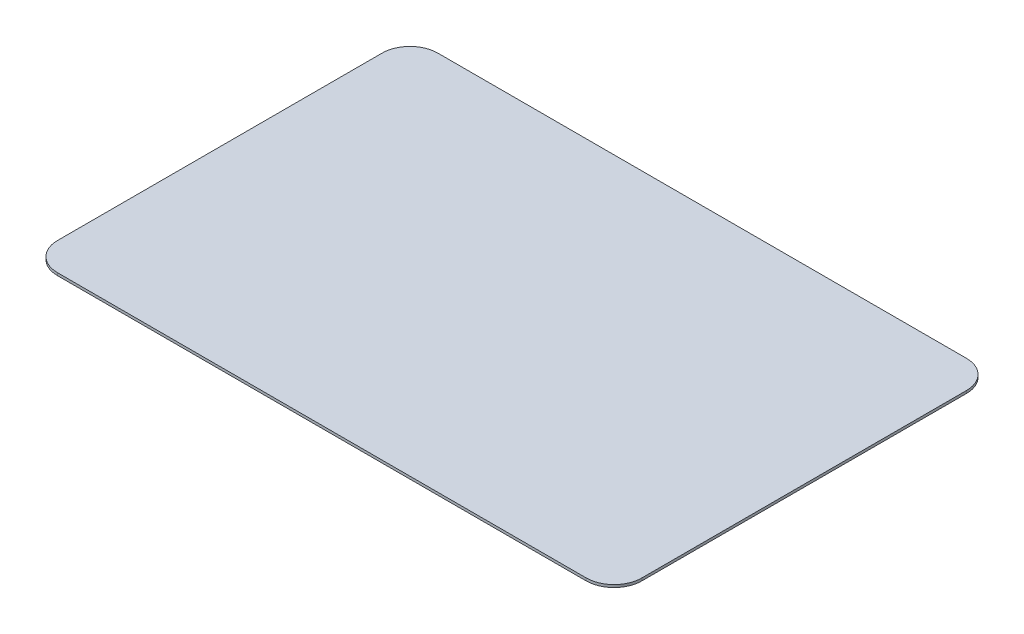
ISO-10303-21;
HEADER;
FILE_DESCRIPTION(('STEP AP214'),'2;1');
FILE_NAME('part.step','',(''),(''),'','','');
FILE_SCHEMA(('AUTOMOTIVE_DESIGN { 1 0 10303 214 1 1 1 1 }'));
ENDSEC;
DATA;
#1=APPLICATION_CONTEXT('core data for automotive mechanical design processes');
#2=APPLICATION_PROTOCOL_DEFINITION('international standard','automotive_design',2000,#1);
#3=PRODUCT_CONTEXT('',#1,'mechanical');
#4=PRODUCT('Part','Part','',(#3));
#5=PRODUCT_RELATED_PRODUCT_CATEGORY('part','',(#4));
#6=PRODUCT_DEFINITION_FORMATION('','',#4);
#7=PRODUCT_DEFINITION_CONTEXT('part definition',#1,'design');
#8=PRODUCT_DEFINITION('design','',#6,#7);
#9=PRODUCT_DEFINITION_SHAPE('','',#8);
#10=(LENGTH_UNIT() NAMED_UNIT(*) SI_UNIT(.MILLI.,.METRE.));
#11=(NAMED_UNIT(*) PLANE_ANGLE_UNIT() SI_UNIT($,.RADIAN.));
#12=(NAMED_UNIT(*) SI_UNIT($,.STERADIAN.) SOLID_ANGLE_UNIT());
#13=UNCERTAINTY_MEASURE_WITH_UNIT(LENGTH_MEASURE(1.E-05),#10,'distance_accuracy_value','');
#14=(GEOMETRIC_REPRESENTATION_CONTEXT(3) GLOBAL_UNCERTAINTY_ASSIGNED_CONTEXT((#13)) GLOBAL_UNIT_ASSIGNED_CONTEXT((#10,
#11,#12)) REPRESENTATION_CONTEXT('',''));
#15=CARTESIAN_POINT('',(0.,0.,0.));
#16=DIRECTION('',(0.,0.,1.));
#17=DIRECTION('',(1.,0.,0.));
#18=AXIS2_PLACEMENT_3D('',#15,#16,#17);
#19=CARTESIAN_POINT('',(60.,0.28,3.));
#20=DIRECTION('',(0.,-1.,0.));
#21=DIRECTION('',(0.,0.,-1.));
#22=AXIS2_PLACEMENT_3D('',#19,#20,#21);
#23=CYLINDRICAL_SURFACE('',#22,3.);
#24=CARTESIAN_POINT('',(60.,0.,3.));
#25=DIRECTION('',(0.,1.,0.));
#26=DIRECTION('',(0.,0.,-1.));
#27=AXIS2_PLACEMENT_3D('',#24,#25,#26);
#28=CIRCLE('',#27,3.);
#29=CARTESIAN_POINT('',(63.,0.,3.00000000000002));
#30=VERTEX_POINT('',#29);
#31=CARTESIAN_POINT('',(60.,0.,0.));
#32=VERTEX_POINT('',#31);
#33=EDGE_CURVE('E142',#30,#32,#28,.T.);
#34=ORIENTED_EDGE('',*,*,#33,.T.);
#35=DIRECTION('',(0.,-1.,0.));
#36=VECTOR('',#35,1.);
#37=CARTESIAN_POINT('',(60.,0.28,0.));
#38=LINE('',#37,#36);
#39=CARTESIAN_POINT('',(60.,0.28,0.));
#40=VERTEX_POINT('',#39);
#41=EDGE_CURVE('E11',#40,#32,#38,.T.);
#42=ORIENTED_EDGE('',*,*,#41,.F.);
#43=CARTESIAN_POINT('',(60.,0.28,3.));
#44=DIRECTION('',(0.,1.,0.));
#45=DIRECTION('',(0.,0.,-1.));
#46=AXIS2_PLACEMENT_3D('',#43,#44,#45);
#47=CIRCLE('',#46,3.);
#48=CARTESIAN_POINT('',(63.,0.28,3.00000000000002));
#49=VERTEX_POINT('',#48);
#50=EDGE_CURVE('E164',#49,#40,#47,.T.);
#51=ORIENTED_EDGE('',*,*,#50,.F.);
#52=DIRECTION('',(0.,-1.,0.));
#53=VECTOR('',#52,1.);
#54=CARTESIAN_POINT('',(63.,0.28,3.00000000000002));
#55=LINE('',#54,#53);
#56=EDGE_CURVE('E138',#49,#30,#55,.T.);
#57=ORIENTED_EDGE('',*,*,#56,.T.);
#58=EDGE_LOOP('',(#34,#42,#51,#57));
#59=FACE_BOUND('',#58,.T.);
#60=ADVANCED_FACE('F41',(#59),#23,.T.);
#61=CARTESIAN_POINT('',(3.00000000000002,0.28,0.));
#62=DIRECTION('',(0.,0.,1.));
#63=DIRECTION('',(1.,0.,0.));
#64=AXIS2_PLACEMENT_3D('',#61,#62,#63);
#65=PLANE('',#64);
#66=DIRECTION('',(-1.,0.,0.));
#67=VECTOR('',#66,1.);
#68=CARTESIAN_POINT('',(3.00000000000002,0.,0.));
#69=LINE('',#68,#67);
#70=CARTESIAN_POINT('',(3.00000000000002,0.,0.));
#71=VERTEX_POINT('',#70);
#72=EDGE_CURVE('E146',#32,#71,#69,.T.);
#73=ORIENTED_EDGE('',*,*,#72,.T.);
#74=DIRECTION('',(0.,-1.,0.));
#75=VECTOR('',#74,1.);
#76=CARTESIAN_POINT('',(3.00000000000002,0.28,0.));
#77=LINE('',#76,#75);
#78=CARTESIAN_POINT('',(3.00000000000002,0.28,0.));
#79=VERTEX_POINT('',#78);
#80=EDGE_CURVE('E50',#79,#71,#77,.T.);
#81=ORIENTED_EDGE('',*,*,#80,.F.);
#82=DIRECTION('',(-1.,0.,0.));
#83=VECTOR('',#82,1.);
#84=CARTESIAN_POINT('',(3.00000000000002,0.28,0.));
#85=LINE('',#84,#83);
#86=EDGE_CURVE('E101',#40,#79,#85,.T.);
#87=ORIENTED_EDGE('',*,*,#86,.F.);
#88=ORIENTED_EDGE('',*,*,#41,.T.);
#89=EDGE_LOOP('',(#73,#81,#87,#88));
#90=FACE_BOUND('',#89,.T.);
#91=ADVANCED_FACE('F210',(#90),#65,.F.);
#92=CARTESIAN_POINT('',(3.,0.28,3.));
#93=DIRECTION('',(0.,-1.,0.));
#94=DIRECTION('',(0.,0.,-1.));
#95=AXIS2_PLACEMENT_3D('',#92,#93,#94);
#96=CYLINDRICAL_SURFACE('',#95,3.);
#97=CARTESIAN_POINT('',(3.,0.,3.));
#98=DIRECTION('',(0.,1.,0.));
#99=DIRECTION('',(0.,0.,1.));
#100=AXIS2_PLACEMENT_3D('',#97,#98,#99);
#101=CIRCLE('',#100,3.);
#102=CARTESIAN_POINT('',(0.,0.,3.00000000000002));
#103=VERTEX_POINT('',#102);
#104=EDGE_CURVE('E149',#71,#103,#101,.T.);
#105=ORIENTED_EDGE('',*,*,#104,.T.);
#106=DIRECTION('',(0.,-1.,0.));
#107=VECTOR('',#106,1.);
#108=CARTESIAN_POINT('',(0.,0.28,3.00000000000002));
#109=LINE('',#108,#107);
#110=CARTESIAN_POINT('',(0.,0.28,3.00000000000002));
#111=VERTEX_POINT('',#110);
#112=EDGE_CURVE('E175',#111,#103,#109,.T.);
#113=ORIENTED_EDGE('',*,*,#112,.F.);
#114=CARTESIAN_POINT('',(3.,0.28,3.));
#115=DIRECTION('',(0.,1.,0.));
#116=DIRECTION('',(0.,0.,1.));
#117=AXIS2_PLACEMENT_3D('',#114,#115,#116);
#118=CIRCLE('',#117,3.);
#119=EDGE_CURVE('E185',#79,#111,#118,.T.);
#120=ORIENTED_EDGE('',*,*,#119,.F.);
#121=ORIENTED_EDGE('',*,*,#80,.T.);
#122=EDGE_LOOP('',(#105,#113,#120,#121));
#123=FACE_BOUND('',#122,.T.);
#124=ADVANCED_FACE('F183',(#123),#96,.T.);
#125=CARTESIAN_POINT('',(0.,0.28,3.00000000000002));
#126=DIRECTION('',(1.,0.,0.));
#127=DIRECTION('',(0.,0.,-1.));
#128=AXIS2_PLACEMENT_3D('',#125,#126,#127);
#129=PLANE('',#128);
#130=DIRECTION('',(0.,0.,1.));
#131=VECTOR('',#130,1.);
#132=CARTESIAN_POINT('',(0.,0.,3.00000000000002));
#133=LINE('',#132,#131);
#134=CARTESIAN_POINT('',(0.,0.,38.));
#135=VERTEX_POINT('',#134);
#136=EDGE_CURVE('E152',#103,#135,#133,.T.);
#137=ORIENTED_EDGE('',*,*,#136,.T.);
#138=DIRECTION('',(0.,-1.,0.));
#139=VECTOR('',#138,1.);
#140=CARTESIAN_POINT('',(0.,0.28,38.));
#141=LINE('',#140,#139);
#142=CARTESIAN_POINT('',(0.,0.28,38.));
#143=VERTEX_POINT('',#142);
#144=EDGE_CURVE('E171',#143,#135,#141,.T.);
#145=ORIENTED_EDGE('',*,*,#144,.F.);
#146=DIRECTION('',(0.,0.,1.));
#147=VECTOR('',#146,1.);
#148=CARTESIAN_POINT('',(0.,0.28,3.00000000000002));
#149=LINE('',#148,#147);
#150=EDGE_CURVE('E198',#111,#143,#149,.T.);
#151=ORIENTED_EDGE('',*,*,#150,.F.);
#152=ORIENTED_EDGE('',*,*,#112,.T.);
#153=EDGE_LOOP('',(#137,#145,#151,#152));
#154=FACE_BOUND('',#153,.T.);
#155=ADVANCED_FACE('F193',(#154),#129,.F.);
#156=CARTESIAN_POINT('',(3.,0.28,38.));
#157=DIRECTION('',(0.,-1.,0.));
#158=DIRECTION('',(0.,0.,-1.));
#159=AXIS2_PLACEMENT_3D('',#156,#157,#158);
#160=CYLINDRICAL_SURFACE('',#159,3.);
#161=CARTESIAN_POINT('',(3.,0.,38.));
#162=DIRECTION('',(0.,1.,0.));
#163=DIRECTION('',(0.,0.,1.));
#164=AXIS2_PLACEMENT_3D('',#161,#162,#163);
#165=CIRCLE('',#164,3.);
#166=CARTESIAN_POINT('',(3.,0.,41.));
#167=VERTEX_POINT('',#166);
#168=EDGE_CURVE('E155',#135,#167,#165,.T.);
#169=ORIENTED_EDGE('',*,*,#168,.T.);
#170=DIRECTION('',(0.,-1.,0.));
#171=VECTOR('',#170,1.);
#172=CARTESIAN_POINT('',(3.,0.28,41.));
#173=LINE('',#172,#171);
#174=CARTESIAN_POINT('',(3.,0.28,41.));
#175=VERTEX_POINT('',#174);
#176=EDGE_CURVE('E131',#175,#167,#173,.T.);
#177=ORIENTED_EDGE('',*,*,#176,.F.);
#178=CARTESIAN_POINT('',(3.,0.28,38.));
#179=DIRECTION('',(0.,1.,0.));
#180=DIRECTION('',(0.,0.,1.));
#181=AXIS2_PLACEMENT_3D('',#178,#179,#180);
#182=CIRCLE('',#181,3.);
#183=EDGE_CURVE('E120',#143,#175,#182,.T.);
#184=ORIENTED_EDGE('',*,*,#183,.F.);
#185=ORIENTED_EDGE('',*,*,#144,.T.);
#186=EDGE_LOOP('',(#169,#177,#184,#185));
#187=FACE_BOUND('',#186,.T.);
#188=ADVANCED_FACE('F196',(#187),#160,.T.);
#189=CARTESIAN_POINT('',(3.00000000000003,0.28,41.));
#190=DIRECTION('',(0.,0.,-1.));
#191=DIRECTION('',(-1.,0.,0.));
#192=AXIS2_PLACEMENT_3D('',#189,#190,#191);
#193=PLANE('',#192);
#194=DIRECTION('',(1.,0.,0.));
#195=VECTOR('',#194,1.);
#196=CARTESIAN_POINT('',(3.00000000000003,0.,41.));
#197=LINE('',#196,#195);
#198=CARTESIAN_POINT('',(60.,0.,41.));
#199=VERTEX_POINT('',#198);
#200=EDGE_CURVE('E129',#167,#199,#197,.T.);
#201=ORIENTED_EDGE('',*,*,#200,.T.);
#202=DIRECTION('',(0.,-1.,0.));
#203=VECTOR('',#202,1.);
#204=CARTESIAN_POINT('',(60.,0.28,41.));
#205=LINE('',#204,#203);
#206=CARTESIAN_POINT('',(60.,0.28,41.));
#207=VERTEX_POINT('',#206);
#208=EDGE_CURVE('E126',#207,#199,#205,.T.);
#209=ORIENTED_EDGE('',*,*,#208,.F.);
#210=DIRECTION('',(1.,0.,0.));
#211=VECTOR('',#210,1.);
#212=CARTESIAN_POINT('',(3.00000000000003,0.28,41.));
#213=LINE('',#212,#211);
#214=EDGE_CURVE('E114',#175,#207,#213,.T.);
#215=ORIENTED_EDGE('',*,*,#214,.F.);
#216=ORIENTED_EDGE('',*,*,#176,.T.);
#217=EDGE_LOOP('',(#201,#209,#215,#216));
#218=FACE_BOUND('',#217,.T.);
#219=ADVANCED_FACE('F127',(#218),#193,.F.);
#220=CARTESIAN_POINT('',(60.,0.28,38.));
#221=DIRECTION('',(0.,-1.,0.));
#222=DIRECTION('',(0.,0.,-1.));
#223=AXIS2_PLACEMENT_3D('',#220,#221,#222);
#224=CYLINDRICAL_SURFACE('',#223,3.);
#225=CARTESIAN_POINT('',(60.,0.,38.));
#226=DIRECTION('',(0.,1.,0.));
#227=DIRECTION('',(0.,0.,1.));
#228=AXIS2_PLACEMENT_3D('',#225,#226,#227);
#229=CIRCLE('',#228,3.);
#230=CARTESIAN_POINT('',(63.,0.,38.));
#231=VERTEX_POINT('',#230);
#232=EDGE_CURVE('E87',#199,#231,#229,.T.);
#233=ORIENTED_EDGE('',*,*,#232,.T.);
#234=DIRECTION('',(0.,-1.,0.));
#235=VECTOR('',#234,1.);
#236=CARTESIAN_POINT('',(63.,0.28,38.));
#237=LINE('',#236,#235);
#238=CARTESIAN_POINT('',(63.,0.28,38.));
#239=VERTEX_POINT('',#238);
#240=EDGE_CURVE('E132',#239,#231,#237,.T.);
#241=ORIENTED_EDGE('',*,*,#240,.F.);
#242=CARTESIAN_POINT('',(60.,0.28,38.));
#243=DIRECTION('',(0.,1.,0.));
#244=DIRECTION('',(0.,0.,1.));
#245=AXIS2_PLACEMENT_3D('',#242,#243,#244);
#246=CIRCLE('',#245,3.);
#247=EDGE_CURVE('E118',#207,#239,#246,.T.);
#248=ORIENTED_EDGE('',*,*,#247,.F.);
#249=ORIENTED_EDGE('',*,*,#208,.T.);
#250=EDGE_LOOP('',(#233,#241,#248,#249));
#251=FACE_BOUND('',#250,.T.);
#252=ADVANCED_FACE('F134',(#251),#224,.T.);
#253=CARTESIAN_POINT('',(63.,0.28,3.00000000000002));
#254=DIRECTION('',(-1.,0.,0.));
#255=DIRECTION('',(0.,0.,1.));
#256=AXIS2_PLACEMENT_3D('',#253,#254,#255);
#257=PLANE('',#256);
#258=DIRECTION('',(0.,0.,-1.));
#259=VECTOR('',#258,1.);
#260=CARTESIAN_POINT('',(63.,0.,3.00000000000002));
#261=LINE('',#260,#259);
#262=EDGE_CURVE('E93',#231,#30,#261,.T.);
#263=ORIENTED_EDGE('',*,*,#262,.T.);
#264=ORIENTED_EDGE('',*,*,#56,.F.);
#265=DIRECTION('',(0.,0.,-1.));
#266=VECTOR('',#265,1.);
#267=CARTESIAN_POINT('',(63.,0.28,3.00000000000002));
#268=LINE('',#267,#266);
#269=EDGE_CURVE('E58',#239,#49,#268,.T.);
#270=ORIENTED_EDGE('',*,*,#269,.F.);
#271=ORIENTED_EDGE('',*,*,#240,.T.);
#272=EDGE_LOOP('',(#263,#264,#270,#271));
#273=FACE_BOUND('',#272,.T.);
#274=ADVANCED_FACE('F226',(#273),#257,.F.);
#275=CARTESIAN_POINT('',(60.,0.28,3.));
#276=DIRECTION('',(0.,-1.,0.));
#277=DIRECTION('',(0.,0.,-1.));
#278=AXIS2_PLACEMENT_3D('',#275,#276,#277);
#279=PLANE('',#278);
#280=ORIENTED_EDGE('',*,*,#50,.T.);
#281=ORIENTED_EDGE('',*,*,#86,.T.);
#282=ORIENTED_EDGE('',*,*,#119,.T.);
#283=ORIENTED_EDGE('',*,*,#150,.T.);
#284=ORIENTED_EDGE('',*,*,#183,.T.);
#285=ORIENTED_EDGE('',*,*,#214,.T.);
#286=ORIENTED_EDGE('',*,*,#247,.T.);
#287=ORIENTED_EDGE('',*,*,#269,.T.);
#288=EDGE_LOOP('',(#280,#281,#282,#283,#284,#285,#286,#287));
#289=FACE_BOUND('',#288,.T.);
#290=ADVANCED_FACE('F116',(#289),#279,.F.);
#291=CARTESIAN_POINT('',(60.,0.,3.));
#292=DIRECTION('',(0.,-1.,0.));
#293=DIRECTION('',(0.,0.,-1.));
#294=AXIS2_PLACEMENT_3D('',#291,#292,#293);
#295=PLANE('',#294);
#296=ORIENTED_EDGE('',*,*,#33,.F.);
#297=ORIENTED_EDGE('',*,*,#262,.F.);
#298=ORIENTED_EDGE('',*,*,#232,.F.);
#299=ORIENTED_EDGE('',*,*,#200,.F.);
#300=ORIENTED_EDGE('',*,*,#168,.F.);
#301=ORIENTED_EDGE('',*,*,#136,.F.);
#302=ORIENTED_EDGE('',*,*,#104,.F.);
#303=ORIENTED_EDGE('',*,*,#72,.F.);
#304=EDGE_LOOP('',(#296,#297,#298,#299,#300,#301,#302,#303));
#305=FACE_BOUND('',#304,.T.);
#306=ADVANCED_FACE('F189',(#305),#295,.T.);
#307=CLOSED_SHELL('',(#60,#91,#124,#155,#188,#219,#252,#274,#290,#306));
#308=MANIFOLD_SOLID_BREP('B2',#307);
#309=ADVANCED_BREP_SHAPE_REPRESENTATION('',(#18,#308),#14);
#310=SHAPE_DEFINITION_REPRESENTATION(#9,#309);
ENDSEC;
END-ISO-10303-21;
